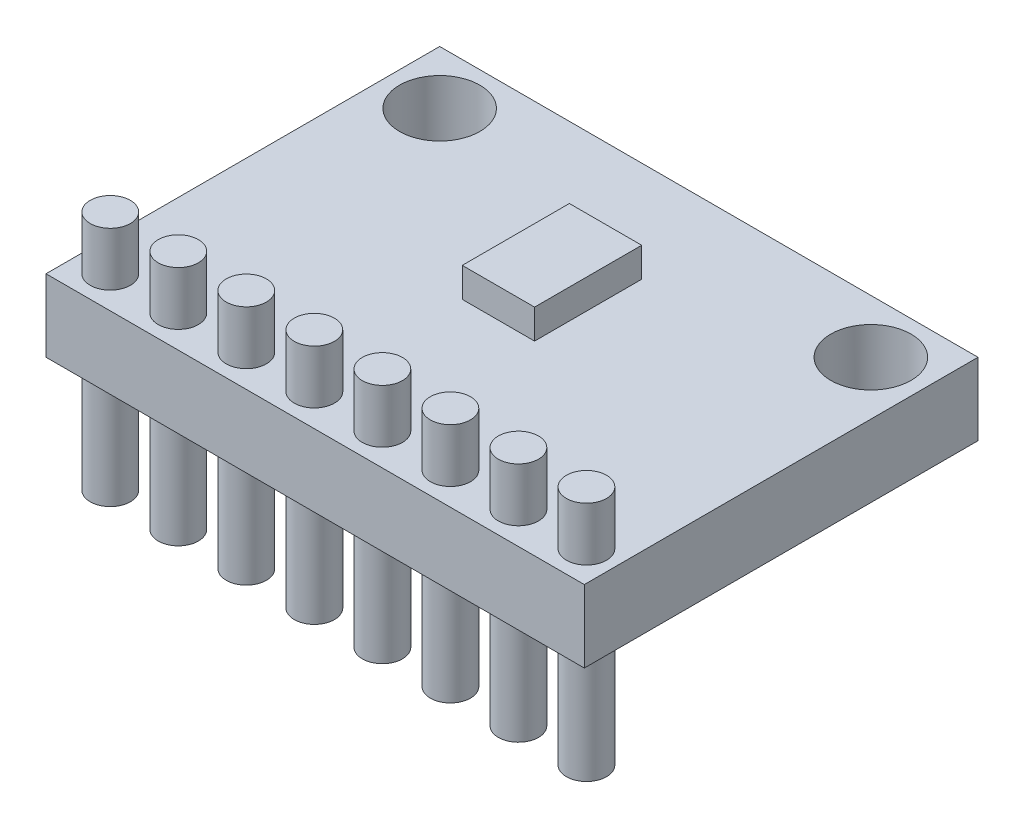
ISO-10303-21;
HEADER;
FILE_DESCRIPTION(('STEP AP214'),'2;1');
FILE_NAME('part.step','',(''),(''),'','','');
FILE_SCHEMA(('AUTOMOTIVE_DESIGN { 1 0 10303 214 1 1 1 1 }'));
ENDSEC;
DATA;
#1=APPLICATION_CONTEXT('core data for automotive mechanical design processes');
#2=APPLICATION_PROTOCOL_DEFINITION('international standard','automotive_design',2000,#1);
#3=PRODUCT_CONTEXT('',#1,'mechanical');
#4=PRODUCT('Part','Part','',(#3));
#5=PRODUCT_RELATED_PRODUCT_CATEGORY('part','',(#4));
#6=PRODUCT_DEFINITION_FORMATION('','',#4);
#7=PRODUCT_DEFINITION_CONTEXT('part definition',#1,'design');
#8=PRODUCT_DEFINITION('design','',#6,#7);
#9=PRODUCT_DEFINITION_SHAPE('','',#8);
#10=(LENGTH_UNIT() NAMED_UNIT(*) SI_UNIT(.MILLI.,.METRE.));
#11=(NAMED_UNIT(*) PLANE_ANGLE_UNIT() SI_UNIT($,.RADIAN.));
#12=(NAMED_UNIT(*) SI_UNIT($,.STERADIAN.) SOLID_ANGLE_UNIT());
#13=UNCERTAINTY_MEASURE_WITH_UNIT(LENGTH_MEASURE(1.E-05),#10,'distance_accuracy_value','');
#14=(GEOMETRIC_REPRESENTATION_CONTEXT(3) GLOBAL_UNCERTAINTY_ASSIGNED_CONTEXT((#13)) GLOBAL_UNIT_ASSIGNED_CONTEXT((#10,
#11,#12)) REPRESENTATION_CONTEXT('',''));
#15=CARTESIAN_POINT('',(0.,0.,0.));
#16=DIRECTION('',(0.,0.,1.));
#17=DIRECTION('',(1.,0.,0.));
#18=AXIS2_PLACEMENT_3D('',#15,#16,#17);
#19=CARTESIAN_POINT('',(0.,2.7,0.));
#20=DIRECTION('',(0.,1.,0.));
#21=DIRECTION('',(0.,0.,1.));
#22=AXIS2_PLACEMENT_3D('',#19,#20,#21);
#23=PLANE('',#22);
#24=CARTESIAN_POINT('',(-8.05,2.7,-5.35));
#25=DIRECTION('',(0.,1.,0.));
#26=DIRECTION('',(0.,0.,1.));
#27=AXIS2_PLACEMENT_3D('',#24,#25,#26);
#28=CIRCLE('',#27,1.5);
#29=CARTESIAN_POINT('',(-8.05,2.7,-3.85));
#30=VERTEX_POINT('',#29);
#31=EDGE_CURVE('E138',#30,#30,#28,.T.);
#32=ORIENTED_EDGE('',*,*,#31,.F.);
#33=EDGE_LOOP('',(#32));
#34=FACE_BOUND('',#33,.T.);
#35=CARTESIAN_POINT('',(8.05,2.7,-5.35));
#36=DIRECTION('',(0.,1.,0.));
#37=DIRECTION('',(0.,0.,-1.));
#38=AXIS2_PLACEMENT_3D('',#35,#36,#37);
#39=CIRCLE('',#38,1.5);
#40=CARTESIAN_POINT('',(8.05,2.7,-6.85));
#41=VERTEX_POINT('',#40);
#42=EDGE_CURVE('E135',#41,#41,#39,.T.);
#43=ORIENTED_EDGE('',*,*,#42,.F.);
#44=EDGE_LOOP('',(#43));
#45=FACE_BOUND('',#44,.T.);
#46=CARTESIAN_POINT('',(8.93,2.7,6.15));
#47=DIRECTION('',(0.,1.,0.));
#48=DIRECTION('',(0.,0.,1.));
#49=AXIS2_PLACEMENT_3D('',#46,#47,#48);
#50=CIRCLE('',#49,0.75);
#51=CARTESIAN_POINT('',(8.93,2.7,6.9));
#52=VERTEX_POINT('',#51);
#53=EDGE_CURVE('E11',#52,#52,#50,.T.);
#54=ORIENTED_EDGE('',*,*,#53,.F.);
#55=EDGE_LOOP('',(#54));
#56=FACE_BOUND('',#55,.T.);
#57=CARTESIAN_POINT('',(6.39,2.7,6.15));
#58=DIRECTION('',(0.,1.,0.));
#59=DIRECTION('',(0.,0.,1.));
#60=AXIS2_PLACEMENT_3D('',#57,#58,#59);
#61=CIRCLE('',#60,0.75);
#62=CARTESIAN_POINT('',(6.39,2.7,6.9));
#63=VERTEX_POINT('',#62);
#64=EDGE_CURVE('E42',#63,#63,#61,.T.);
#65=ORIENTED_EDGE('',*,*,#64,.F.);
#66=EDGE_LOOP('',(#65));
#67=FACE_BOUND('',#66,.T.);
#68=CARTESIAN_POINT('',(3.85,2.7,6.15));
#69=DIRECTION('',(0.,1.,0.));
#70=DIRECTION('',(0.,0.,1.));
#71=AXIS2_PLACEMENT_3D('',#68,#69,#70);
#72=CIRCLE('',#71,0.75);
#73=CARTESIAN_POINT('',(3.85,2.7,6.9));
#74=VERTEX_POINT('',#73);
#75=EDGE_CURVE('E162',#74,#74,#72,.T.);
#76=ORIENTED_EDGE('',*,*,#75,.F.);
#77=EDGE_LOOP('',(#76));
#78=FACE_BOUND('',#77,.T.);
#79=CARTESIAN_POINT('',(1.31,2.7,6.15));
#80=DIRECTION('',(0.,1.,0.));
#81=DIRECTION('',(0.,0.,1.));
#82=AXIS2_PLACEMENT_3D('',#79,#80,#81);
#83=CIRCLE('',#82,0.75);
#84=CARTESIAN_POINT('',(1.31,2.7,6.9));
#85=VERTEX_POINT('',#84);
#86=EDGE_CURVE('E172',#85,#85,#83,.T.);
#87=ORIENTED_EDGE('',*,*,#86,.F.);
#88=EDGE_LOOP('',(#87));
#89=FACE_BOUND('',#88,.T.);
#90=CARTESIAN_POINT('',(-1.23,2.7,6.15));
#91=DIRECTION('',(0.,1.,0.));
#92=DIRECTION('',(0.,0.,1.));
#93=AXIS2_PLACEMENT_3D('',#90,#91,#92);
#94=CIRCLE('',#93,0.75);
#95=CARTESIAN_POINT('',(-1.23,2.7,6.9));
#96=VERTEX_POINT('',#95);
#97=EDGE_CURVE('E182',#96,#96,#94,.T.);
#98=ORIENTED_EDGE('',*,*,#97,.F.);
#99=EDGE_LOOP('',(#98));
#100=FACE_BOUND('',#99,.T.);
#101=CARTESIAN_POINT('',(-3.77,2.7,6.15));
#102=DIRECTION('',(0.,1.,0.));
#103=DIRECTION('',(0.,0.,1.));
#104=AXIS2_PLACEMENT_3D('',#101,#102,#103);
#105=CIRCLE('',#104,0.75);
#106=CARTESIAN_POINT('',(-3.77,2.7,6.9));
#107=VERTEX_POINT('',#106);
#108=EDGE_CURVE('E192',#107,#107,#105,.T.);
#109=ORIENTED_EDGE('',*,*,#108,.F.);
#110=EDGE_LOOP('',(#109));
#111=FACE_BOUND('',#110,.T.);
#112=CARTESIAN_POINT('',(-6.31,2.7,6.15));
#113=DIRECTION('',(0.,1.,0.));
#114=DIRECTION('',(0.,0.,1.));
#115=AXIS2_PLACEMENT_3D('',#112,#113,#114);
#116=CIRCLE('',#115,0.75);
#117=CARTESIAN_POINT('',(-6.31,2.7,6.9));
#118=VERTEX_POINT('',#117);
#119=EDGE_CURVE('E202',#118,#118,#116,.T.);
#120=ORIENTED_EDGE('',*,*,#119,.F.);
#121=EDGE_LOOP('',(#120));
#122=FACE_BOUND('',#121,.T.);
#123=CARTESIAN_POINT('',(-8.85,2.7,6.15));
#124=DIRECTION('',(0.,1.,0.));
#125=DIRECTION('',(0.,0.,1.));
#126=AXIS2_PLACEMENT_3D('',#123,#124,#125);
#127=CIRCLE('',#126,0.75);
#128=CARTESIAN_POINT('',(-8.85,2.7,6.9));
#129=VERTEX_POINT('',#128);
#130=EDGE_CURVE('E212',#129,#129,#127,.T.);
#131=ORIENTED_EDGE('',*,*,#130,.F.);
#132=EDGE_LOOP('',(#131));
#133=FACE_BOUND('',#132,.T.);
#134=DIRECTION('',(0.,0.,1.));
#135=VECTOR('',#134,1.);
#136=CARTESIAN_POINT('',(-10.05,2.7,7.35));
#137=LINE('',#136,#135);
#138=CARTESIAN_POINT('',(-10.05,2.7,-7.35));
#139=VERTEX_POINT('',#138);
#140=CARTESIAN_POINT('',(-10.05,2.7,7.35));
#141=VERTEX_POINT('',#140);
#142=EDGE_CURVE('E223',#139,#141,#137,.T.);
#143=ORIENTED_EDGE('',*,*,#142,.T.);
#144=DIRECTION('',(1.,0.,0.));
#145=VECTOR('',#144,1.);
#146=CARTESIAN_POINT('',(10.05,2.7,7.35));
#147=LINE('',#146,#145);
#148=CARTESIAN_POINT('',(10.05,2.7,7.35));
#149=VERTEX_POINT('',#148);
#150=EDGE_CURVE('E88',#141,#149,#147,.T.);
#151=ORIENTED_EDGE('',*,*,#150,.T.);
#152=DIRECTION('',(0.,0.,-1.));
#153=VECTOR('',#152,1.);
#154=CARTESIAN_POINT('',(10.05,2.7,7.35));
#155=LINE('',#154,#153);
#156=CARTESIAN_POINT('',(10.05,2.7,-7.35));
#157=VERTEX_POINT('',#156);
#158=EDGE_CURVE('E226',#149,#157,#155,.T.);
#159=ORIENTED_EDGE('',*,*,#158,.T.);
#160=DIRECTION('',(-1.,0.,0.));
#161=VECTOR('',#160,1.);
#162=CARTESIAN_POINT('',(10.05,2.7,-7.35));
#163=LINE('',#162,#161);
#164=EDGE_CURVE('E59',#157,#139,#163,.T.);
#165=ORIENTED_EDGE('',*,*,#164,.T.);
#166=EDGE_LOOP('',(#143,#151,#159,#165));
#167=FACE_BOUND('',#166,.T.);
#168=DIRECTION('',(1.,0.,0.));
#169=VECTOR('',#168,1.);
#170=CARTESIAN_POINT('',(1.24921257015135,2.7,0.406762830798667));
#171=LINE('',#170,#169);
#172=CARTESIAN_POINT('',(-1.45078742984866,2.7,0.406762830798667));
#173=VERTEX_POINT('',#172);
#174=CARTESIAN_POINT('',(1.24921257015135,2.7,0.406762830798667));
#175=VERTEX_POINT('',#174);
#176=EDGE_CURVE('E316',#173,#175,#171,.T.);
#177=ORIENTED_EDGE('',*,*,#176,.F.);
#178=DIRECTION('',(0.,0.,1.));
#179=VECTOR('',#178,1.);
#180=CARTESIAN_POINT('',(-1.45078742984866,2.7,-3.59323716920133));
#181=LINE('',#180,#179);
#182=CARTESIAN_POINT('',(-1.45078742984866,2.7,-3.59323716920133));
#183=VERTEX_POINT('',#182);
#184=EDGE_CURVE('E133',#183,#173,#181,.T.);
#185=ORIENTED_EDGE('',*,*,#184,.F.);
#186=DIRECTION('',(-1.,0.,0.));
#187=VECTOR('',#186,1.);
#188=CARTESIAN_POINT('',(1.24921257015134,2.7,-3.59323716920133));
#189=LINE('',#188,#187);
#190=CARTESIAN_POINT('',(1.24921257015134,2.7,-3.59323716920133));
#191=VERTEX_POINT('',#190);
#192=EDGE_CURVE('E129',#191,#183,#189,.T.);
#193=ORIENTED_EDGE('',*,*,#192,.F.);
#194=DIRECTION('',(0.,0.,-1.));
#195=VECTOR('',#194,1.);
#196=CARTESIAN_POINT('',(1.24921257015134,2.7,-3.59323716920133));
#197=LINE('',#196,#195);
#198=EDGE_CURVE('E318',#175,#191,#197,.T.);
#199=ORIENTED_EDGE('',*,*,#198,.F.);
#200=EDGE_LOOP('',(#177,#185,#193,#199));
#201=FACE_BOUND('',#200,.T.);
#202=ADVANCED_FACE('F33',(#34,#45,#56,#67,#78,#89,#100,#111,#122,#133,#167,#201),#23,.T.);
#203=CARTESIAN_POINT('',(-10.05,2.7,7.35));
#204=DIRECTION('',(1.,0.,0.));
#205=DIRECTION('',(0.,0.,-1.));
#206=AXIS2_PLACEMENT_3D('',#203,#204,#205);
#207=PLANE('',#206);
#208=DIRECTION('',(0.,0.,1.));
#209=VECTOR('',#208,1.);
#210=CARTESIAN_POINT('',(-10.05,0.,7.35));
#211=LINE('',#210,#209);
#212=CARTESIAN_POINT('',(-10.05,0.,-7.35));
#213=VERTEX_POINT('',#212);
#214=CARTESIAN_POINT('',(-10.05,0.,7.35));
#215=VERTEX_POINT('',#214);
#216=EDGE_CURVE('E230',#213,#215,#211,.T.);
#217=ORIENTED_EDGE('',*,*,#216,.T.);
#218=DIRECTION('',(0.,-1.,0.));
#219=VECTOR('',#218,1.);
#220=CARTESIAN_POINT('',(-10.05,2.7,7.35));
#221=LINE('',#220,#219);
#222=EDGE_CURVE('E222',#141,#215,#221,.T.);
#223=ORIENTED_EDGE('',*,*,#222,.F.);
#224=ORIENTED_EDGE('',*,*,#142,.F.);
#225=DIRECTION('',(0.,-1.,0.));
#226=VECTOR('',#225,1.);
#227=CARTESIAN_POINT('',(-10.05,2.7,-7.35));
#228=LINE('',#227,#226);
#229=EDGE_CURVE('E229',#139,#213,#228,.T.);
#230=ORIENTED_EDGE('',*,*,#229,.T.);
#231=EDGE_LOOP('',(#217,#223,#224,#230));
#232=FACE_BOUND('',#231,.T.);
#233=ADVANCED_FACE('F35',(#232),#207,.F.);
#234=CARTESIAN_POINT('',(10.05,2.7,7.35));
#235=DIRECTION('',(0.,0.,-1.));
#236=DIRECTION('',(-1.,0.,0.));
#237=AXIS2_PLACEMENT_3D('',#234,#235,#236);
#238=PLANE('',#237);
#239=DIRECTION('',(1.,0.,0.));
#240=VECTOR('',#239,1.);
#241=CARTESIAN_POINT('',(10.05,0.,7.35));
#242=LINE('',#241,#240);
#243=CARTESIAN_POINT('',(10.05,0.,7.35));
#244=VERTEX_POINT('',#243);
#245=EDGE_CURVE('E233',#215,#244,#242,.T.);
#246=ORIENTED_EDGE('',*,*,#245,.T.);
#247=DIRECTION('',(0.,-1.,0.));
#248=VECTOR('',#247,1.);
#249=CARTESIAN_POINT('',(10.05,2.7,7.35));
#250=LINE('',#249,#248);
#251=EDGE_CURVE('E241',#149,#244,#250,.T.);
#252=ORIENTED_EDGE('',*,*,#251,.F.);
#253=ORIENTED_EDGE('',*,*,#150,.F.);
#254=ORIENTED_EDGE('',*,*,#222,.T.);
#255=EDGE_LOOP('',(#246,#252,#253,#254));
#256=FACE_BOUND('',#255,.T.);
#257=ADVANCED_FACE('F287',(#256),#238,.F.);
#258=CARTESIAN_POINT('',(10.05,2.7,7.35));
#259=DIRECTION('',(-1.,0.,0.));
#260=DIRECTION('',(0.,0.,1.));
#261=AXIS2_PLACEMENT_3D('',#258,#259,#260);
#262=PLANE('',#261);
#263=DIRECTION('',(0.,0.,-1.));
#264=VECTOR('',#263,1.);
#265=CARTESIAN_POINT('',(10.05,0.,7.35));
#266=LINE('',#265,#264);
#267=CARTESIAN_POINT('',(10.05,0.,-7.35));
#268=VERTEX_POINT('',#267);
#269=EDGE_CURVE('E235',#244,#268,#266,.T.);
#270=ORIENTED_EDGE('',*,*,#269,.T.);
#271=DIRECTION('',(0.,-1.,0.));
#272=VECTOR('',#271,1.);
#273=CARTESIAN_POINT('',(10.05,2.7,-7.35));
#274=LINE('',#273,#272);
#275=EDGE_CURVE('E239',#157,#268,#274,.T.);
#276=ORIENTED_EDGE('',*,*,#275,.F.);
#277=ORIENTED_EDGE('',*,*,#158,.F.);
#278=ORIENTED_EDGE('',*,*,#251,.T.);
#279=EDGE_LOOP('',(#270,#276,#277,#278));
#280=FACE_BOUND('',#279,.T.);
#281=ADVANCED_FACE('F301',(#280),#262,.F.);
#282=CARTESIAN_POINT('',(10.05,2.7,-7.35));
#283=DIRECTION('',(0.,0.,1.));
#284=DIRECTION('',(1.,0.,0.));
#285=AXIS2_PLACEMENT_3D('',#282,#283,#284);
#286=PLANE('',#285);
#287=DIRECTION('',(-1.,0.,0.));
#288=VECTOR('',#287,1.);
#289=CARTESIAN_POINT('',(10.05,0.,-7.35));
#290=LINE('',#289,#288);
#291=EDGE_CURVE('E80',#268,#213,#290,.T.);
#292=ORIENTED_EDGE('',*,*,#291,.T.);
#293=ORIENTED_EDGE('',*,*,#229,.F.);
#294=ORIENTED_EDGE('',*,*,#164,.F.);
#295=ORIENTED_EDGE('',*,*,#275,.T.);
#296=EDGE_LOOP('',(#292,#293,#294,#295));
#297=FACE_BOUND('',#296,.T.);
#298=ADVANCED_FACE('F298',(#297),#286,.F.);
#299=CARTESIAN_POINT('',(0.,0.,0.));
#300=DIRECTION('',(0.,1.,0.));
#301=DIRECTION('',(0.,0.,1.));
#302=AXIS2_PLACEMENT_3D('',#299,#300,#301);
#303=PLANE('',#302);
#304=CARTESIAN_POINT('',(-8.05,0.,-5.35));
#305=DIRECTION('',(0.,1.,0.));
#306=DIRECTION('',(0.,0.,1.));
#307=AXIS2_PLACEMENT_3D('',#304,#305,#306);
#308=CIRCLE('',#307,1.5);
#309=CARTESIAN_POINT('',(-8.05,0.,-3.85));
#310=VERTEX_POINT('',#309);
#311=EDGE_CURVE('E37',#310,#310,#308,.T.);
#312=ORIENTED_EDGE('',*,*,#311,.T.);
#313=EDGE_LOOP('',(#312));
#314=FACE_BOUND('',#313,.T.);
#315=CARTESIAN_POINT('',(8.05,0.,-5.35));
#316=DIRECTION('',(0.,1.,0.));
#317=DIRECTION('',(0.,0.,1.));
#318=AXIS2_PLACEMENT_3D('',#315,#316,#317);
#319=CIRCLE('',#318,1.5);
#320=CARTESIAN_POINT('',(8.05,0.,-3.85));
#321=VERTEX_POINT('',#320);
#322=EDGE_CURVE('E144',#321,#321,#319,.T.);
#323=ORIENTED_EDGE('',*,*,#322,.T.);
#324=EDGE_LOOP('',(#323));
#325=FACE_BOUND('',#324,.T.);
#326=CARTESIAN_POINT('',(8.93,0.,6.15));
#327=DIRECTION('',(0.,1.,0.));
#328=DIRECTION('',(0.,0.,1.));
#329=AXIS2_PLACEMENT_3D('',#326,#327,#328);
#330=CIRCLE('',#329,0.75);
#331=CARTESIAN_POINT('',(8.93,0.,6.9));
#332=VERTEX_POINT('',#331);
#333=EDGE_CURVE('E151',#332,#332,#330,.T.);
#334=ORIENTED_EDGE('',*,*,#333,.T.);
#335=EDGE_LOOP('',(#334));
#336=FACE_BOUND('',#335,.T.);
#337=CARTESIAN_POINT('',(6.39,0.,6.15));
#338=DIRECTION('',(0.,1.,0.));
#339=DIRECTION('',(0.,0.,1.));
#340=AXIS2_PLACEMENT_3D('',#337,#338,#339);
#341=CIRCLE('',#340,0.75);
#342=CARTESIAN_POINT('',(6.39,0.,6.9));
#343=VERTEX_POINT('',#342);
#344=EDGE_CURVE('E159',#343,#343,#341,.T.);
#345=ORIENTED_EDGE('',*,*,#344,.T.);
#346=EDGE_LOOP('',(#345));
#347=FACE_BOUND('',#346,.T.);
#348=CARTESIAN_POINT('',(3.85,0.,6.15));
#349=DIRECTION('',(0.,1.,0.));
#350=DIRECTION('',(0.,0.,1.));
#351=AXIS2_PLACEMENT_3D('',#348,#349,#350);
#352=CIRCLE('',#351,0.75);
#353=CARTESIAN_POINT('',(3.85,0.,6.9));
#354=VERTEX_POINT('',#353);
#355=EDGE_CURVE('E169',#354,#354,#352,.T.);
#356=ORIENTED_EDGE('',*,*,#355,.T.);
#357=EDGE_LOOP('',(#356));
#358=FACE_BOUND('',#357,.T.);
#359=CARTESIAN_POINT('',(1.31,0.,6.15));
#360=DIRECTION('',(0.,1.,0.));
#361=DIRECTION('',(0.,0.,1.));
#362=AXIS2_PLACEMENT_3D('',#359,#360,#361);
#363=CIRCLE('',#362,0.75);
#364=CARTESIAN_POINT('',(1.31,0.,6.9));
#365=VERTEX_POINT('',#364);
#366=EDGE_CURVE('E179',#365,#365,#363,.T.);
#367=ORIENTED_EDGE('',*,*,#366,.T.);
#368=EDGE_LOOP('',(#367));
#369=FACE_BOUND('',#368,.T.);
#370=CARTESIAN_POINT('',(-1.23,0.,6.15));
#371=DIRECTION('',(0.,1.,0.));
#372=DIRECTION('',(0.,0.,1.));
#373=AXIS2_PLACEMENT_3D('',#370,#371,#372);
#374=CIRCLE('',#373,0.75);
#375=CARTESIAN_POINT('',(-1.23,0.,6.9));
#376=VERTEX_POINT('',#375);
#377=EDGE_CURVE('E189',#376,#376,#374,.T.);
#378=ORIENTED_EDGE('',*,*,#377,.T.);
#379=EDGE_LOOP('',(#378));
#380=FACE_BOUND('',#379,.T.);
#381=CARTESIAN_POINT('',(-3.77,0.,6.15));
#382=DIRECTION('',(0.,1.,0.));
#383=DIRECTION('',(0.,0.,1.));
#384=AXIS2_PLACEMENT_3D('',#381,#382,#383);
#385=CIRCLE('',#384,0.75);
#386=CARTESIAN_POINT('',(-3.77,0.,6.9));
#387=VERTEX_POINT('',#386);
#388=EDGE_CURVE('E199',#387,#387,#385,.T.);
#389=ORIENTED_EDGE('',*,*,#388,.T.);
#390=EDGE_LOOP('',(#389));
#391=FACE_BOUND('',#390,.T.);
#392=CARTESIAN_POINT('',(-6.31,0.,6.15));
#393=DIRECTION('',(0.,1.,0.));
#394=DIRECTION('',(0.,0.,1.));
#395=AXIS2_PLACEMENT_3D('',#392,#393,#394);
#396=CIRCLE('',#395,0.75);
#397=CARTESIAN_POINT('',(-6.31,0.,6.9));
#398=VERTEX_POINT('',#397);
#399=EDGE_CURVE('E209',#398,#398,#396,.T.);
#400=ORIENTED_EDGE('',*,*,#399,.T.);
#401=EDGE_LOOP('',(#400));
#402=FACE_BOUND('',#401,.T.);
#403=CARTESIAN_POINT('',(-8.85,0.,6.15));
#404=DIRECTION('',(0.,1.,0.));
#405=DIRECTION('',(0.,0.,1.));
#406=AXIS2_PLACEMENT_3D('',#403,#404,#405);
#407=CIRCLE('',#406,0.75);
#408=CARTESIAN_POINT('',(-8.85,0.,6.9));
#409=VERTEX_POINT('',#408);
#410=EDGE_CURVE('E219',#409,#409,#407,.T.);
#411=ORIENTED_EDGE('',*,*,#410,.T.);
#412=EDGE_LOOP('',(#411));
#413=FACE_BOUND('',#412,.T.);
#414=ORIENTED_EDGE('',*,*,#216,.F.);
#415=ORIENTED_EDGE('',*,*,#291,.F.);
#416=ORIENTED_EDGE('',*,*,#269,.F.);
#417=ORIENTED_EDGE('',*,*,#245,.F.);
#418=EDGE_LOOP('',(#414,#415,#416,#417));
#419=FACE_BOUND('',#418,.T.);
#420=ADVANCED_FACE('F266',(#314,#325,#336,#347,#358,#369,#380,#391,#402,#413,#419),#303,.F.);
#421=CARTESIAN_POINT('',(-8.85,-4.3,6.15));
#422=DIRECTION('',(0.,1.,0.));
#423=DIRECTION('',(0.,0.,1.));
#424=AXIS2_PLACEMENT_3D('',#421,#422,#423);
#425=PLANE('',#424);
#426=CARTESIAN_POINT('',(-8.85,-4.3,6.15));
#427=DIRECTION('',(0.,1.,0.));
#428=DIRECTION('',(0.,0.,1.));
#429=AXIS2_PLACEMENT_3D('',#426,#427,#428);
#430=CIRCLE('',#429,0.75);
#431=CARTESIAN_POINT('',(-8.85,-4.3,6.9));
#432=VERTEX_POINT('',#431);
#433=EDGE_CURVE('E216',#432,#432,#430,.T.);
#434=ORIENTED_EDGE('',*,*,#433,.F.);
#435=EDGE_LOOP('',(#434));
#436=FACE_BOUND('',#435,.T.);
#437=ADVANCED_FACE('F297',(#436),#425,.F.);
#438=CARTESIAN_POINT('',(-8.85,-4.3,6.15));
#439=DIRECTION('',(0.,1.,0.));
#440=DIRECTION('',(0.,0.,1.));
#441=AXIS2_PLACEMENT_3D('',#438,#439,#440);
#442=CYLINDRICAL_SURFACE('',#441,0.75);
#443=ORIENTED_EDGE('',*,*,#433,.T.);
#444=EDGE_LOOP('',(#443));
#445=FACE_BOUND('',#444,.T.);
#446=ORIENTED_EDGE('',*,*,#410,.F.);
#447=EDGE_LOOP('',(#446));
#448=FACE_BOUND('',#447,.T.);
#449=ADVANCED_FACE('F641',(#445,#448),#442,.T.);
#450=ORIENTED_EDGE('',*,*,#130,.T.);
#451=EDGE_LOOP('',(#450));
#452=FACE_BOUND('',#451,.T.);
#453=CARTESIAN_POINT('',(-8.85,4.7,6.15));
#454=DIRECTION('',(0.,1.,0.));
#455=DIRECTION('',(0.,0.,1.));
#456=AXIS2_PLACEMENT_3D('',#453,#454,#455);
#457=CIRCLE('',#456,0.75);
#458=CARTESIAN_POINT('',(-8.85,4.7,6.9));
#459=VERTEX_POINT('',#458);
#460=EDGE_CURVE('E213',#459,#459,#457,.T.);
#461=ORIENTED_EDGE('',*,*,#460,.F.);
#462=EDGE_LOOP('',(#461));
#463=FACE_BOUND('',#462,.T.);
#464=ADVANCED_FACE('F293',(#452,#463),#442,.T.);
#465=CARTESIAN_POINT('',(-8.85,4.7,6.15));
#466=DIRECTION('',(0.,1.,0.));
#467=DIRECTION('',(0.,0.,1.));
#468=AXIS2_PLACEMENT_3D('',#465,#466,#467);
#469=PLANE('',#468);
#470=ORIENTED_EDGE('',*,*,#460,.T.);
#471=EDGE_LOOP('',(#470));
#472=FACE_BOUND('',#471,.T.);
#473=ADVANCED_FACE('F624',(#472),#469,.T.);
#474=CARTESIAN_POINT('',(-6.31,-4.3,6.15));
#475=DIRECTION('',(0.,1.,0.));
#476=DIRECTION('',(0.,0.,1.));
#477=AXIS2_PLACEMENT_3D('',#474,#475,#476);
#478=PLANE('',#477);
#479=CARTESIAN_POINT('',(-6.31,-4.3,6.15));
#480=DIRECTION('',(0.,1.,0.));
#481=DIRECTION('',(0.,0.,1.));
#482=AXIS2_PLACEMENT_3D('',#479,#480,#481);
#483=CIRCLE('',#482,0.75);
#484=CARTESIAN_POINT('',(-6.31,-4.3,6.9));
#485=VERTEX_POINT('',#484);
#486=EDGE_CURVE('E206',#485,#485,#483,.T.);
#487=ORIENTED_EDGE('',*,*,#486,.F.);
#488=EDGE_LOOP('',(#487));
#489=FACE_BOUND('',#488,.T.);
#490=ADVANCED_FACE('F616',(#489),#478,.F.);
#491=CARTESIAN_POINT('',(-6.31,-4.3,6.15));
#492=DIRECTION('',(0.,1.,0.));
#493=DIRECTION('',(0.,0.,1.));
#494=AXIS2_PLACEMENT_3D('',#491,#492,#493);
#495=CYLINDRICAL_SURFACE('',#494,0.75);
#496=ORIENTED_EDGE('',*,*,#486,.T.);
#497=EDGE_LOOP('',(#496));
#498=FACE_BOUND('',#497,.T.);
#499=ORIENTED_EDGE('',*,*,#399,.F.);
#500=EDGE_LOOP('',(#499));
#501=FACE_BOUND('',#500,.T.);
#502=ADVANCED_FACE('F607',(#498,#501),#495,.T.);
#503=ORIENTED_EDGE('',*,*,#119,.T.);
#504=EDGE_LOOP('',(#503));
#505=FACE_BOUND('',#504,.T.);
#506=CARTESIAN_POINT('',(-6.31,4.7,6.15));
#507=DIRECTION('',(0.,1.,0.));
#508=DIRECTION('',(0.,0.,1.));
#509=AXIS2_PLACEMENT_3D('',#506,#507,#508);
#510=CIRCLE('',#509,0.75);
#511=CARTESIAN_POINT('',(-6.31,4.7,6.9));
#512=VERTEX_POINT('',#511);
#513=EDGE_CURVE('E203',#512,#512,#510,.T.);
#514=ORIENTED_EDGE('',*,*,#513,.F.);
#515=EDGE_LOOP('',(#514));
#516=FACE_BOUND('',#515,.T.);
#517=ADVANCED_FACE('F598',(#505,#516),#495,.T.);
#518=CARTESIAN_POINT('',(-6.31,4.7,6.15));
#519=DIRECTION('',(0.,1.,0.));
#520=DIRECTION('',(0.,0.,1.));
#521=AXIS2_PLACEMENT_3D('',#518,#519,#520);
#522=PLANE('',#521);
#523=ORIENTED_EDGE('',*,*,#513,.T.);
#524=EDGE_LOOP('',(#523));
#525=FACE_BOUND('',#524,.T.);
#526=ADVANCED_FACE('F589',(#525),#522,.T.);
#527=CARTESIAN_POINT('',(-3.77,-4.3,6.15));
#528=DIRECTION('',(0.,1.,0.));
#529=DIRECTION('',(0.,0.,1.));
#530=AXIS2_PLACEMENT_3D('',#527,#528,#529);
#531=PLANE('',#530);
#532=CARTESIAN_POINT('',(-3.77,-4.3,6.15));
#533=DIRECTION('',(0.,1.,0.));
#534=DIRECTION('',(0.,0.,1.));
#535=AXIS2_PLACEMENT_3D('',#532,#533,#534);
#536=CIRCLE('',#535,0.75);
#537=CARTESIAN_POINT('',(-3.77,-4.3,6.9));
#538=VERTEX_POINT('',#537);
#539=EDGE_CURVE('E196',#538,#538,#536,.T.);
#540=ORIENTED_EDGE('',*,*,#539,.F.);
#541=EDGE_LOOP('',(#540));
#542=FACE_BOUND('',#541,.T.);
#543=ADVANCED_FACE('F581',(#542),#531,.F.);
#544=CARTESIAN_POINT('',(-3.77,-4.3,6.15));
#545=DIRECTION('',(0.,1.,0.));
#546=DIRECTION('',(0.,0.,1.));
#547=AXIS2_PLACEMENT_3D('',#544,#545,#546);
#548=CYLINDRICAL_SURFACE('',#547,0.75);
#549=ORIENTED_EDGE('',*,*,#539,.T.);
#550=EDGE_LOOP('',(#549));
#551=FACE_BOUND('',#550,.T.);
#552=ORIENTED_EDGE('',*,*,#388,.F.);
#553=EDGE_LOOP('',(#552));
#554=FACE_BOUND('',#553,.T.);
#555=ADVANCED_FACE('F572',(#551,#554),#548,.T.);
#556=ORIENTED_EDGE('',*,*,#108,.T.);
#557=EDGE_LOOP('',(#556));
#558=FACE_BOUND('',#557,.T.);
#559=CARTESIAN_POINT('',(-3.77,4.7,6.15));
#560=DIRECTION('',(0.,1.,0.));
#561=DIRECTION('',(0.,0.,1.));
#562=AXIS2_PLACEMENT_3D('',#559,#560,#561);
#563=CIRCLE('',#562,0.75);
#564=CARTESIAN_POINT('',(-3.77,4.7,6.9));
#565=VERTEX_POINT('',#564);
#566=EDGE_CURVE('E193',#565,#565,#563,.T.);
#567=ORIENTED_EDGE('',*,*,#566,.F.);
#568=EDGE_LOOP('',(#567));
#569=FACE_BOUND('',#568,.T.);
#570=ADVANCED_FACE('F563',(#558,#569),#548,.T.);
#571=CARTESIAN_POINT('',(-3.77,4.7,6.15));
#572=DIRECTION('',(0.,1.,0.));
#573=DIRECTION('',(0.,0.,1.));
#574=AXIS2_PLACEMENT_3D('',#571,#572,#573);
#575=PLANE('',#574);
#576=ORIENTED_EDGE('',*,*,#566,.T.);
#577=EDGE_LOOP('',(#576));
#578=FACE_BOUND('',#577,.T.);
#579=ADVANCED_FACE('F554',(#578),#575,.T.);
#580=CARTESIAN_POINT('',(-1.23,-4.3,6.15));
#581=DIRECTION('',(0.,1.,0.));
#582=DIRECTION('',(0.,0.,1.));
#583=AXIS2_PLACEMENT_3D('',#580,#581,#582);
#584=PLANE('',#583);
#585=CARTESIAN_POINT('',(-1.23,-4.3,6.15));
#586=DIRECTION('',(0.,1.,0.));
#587=DIRECTION('',(0.,0.,1.));
#588=AXIS2_PLACEMENT_3D('',#585,#586,#587);
#589=CIRCLE('',#588,0.75);
#590=CARTESIAN_POINT('',(-1.23,-4.3,6.9));
#591=VERTEX_POINT('',#590);
#592=EDGE_CURVE('E186',#591,#591,#589,.T.);
#593=ORIENTED_EDGE('',*,*,#592,.F.);
#594=EDGE_LOOP('',(#593));
#595=FACE_BOUND('',#594,.T.);
#596=ADVANCED_FACE('F546',(#595),#584,.F.);
#597=CARTESIAN_POINT('',(-1.23,-4.3,6.15));
#598=DIRECTION('',(0.,1.,0.));
#599=DIRECTION('',(0.,0.,1.));
#600=AXIS2_PLACEMENT_3D('',#597,#598,#599);
#601=CYLINDRICAL_SURFACE('',#600,0.75);
#602=ORIENTED_EDGE('',*,*,#592,.T.);
#603=EDGE_LOOP('',(#602));
#604=FACE_BOUND('',#603,.T.);
#605=ORIENTED_EDGE('',*,*,#377,.F.);
#606=EDGE_LOOP('',(#605));
#607=FACE_BOUND('',#606,.T.);
#608=ADVANCED_FACE('F537',(#604,#607),#601,.T.);
#609=ORIENTED_EDGE('',*,*,#97,.T.);
#610=EDGE_LOOP('',(#609));
#611=FACE_BOUND('',#610,.T.);
#612=CARTESIAN_POINT('',(-1.23,4.7,6.15));
#613=DIRECTION('',(0.,1.,0.));
#614=DIRECTION('',(0.,0.,1.));
#615=AXIS2_PLACEMENT_3D('',#612,#613,#614);
#616=CIRCLE('',#615,0.75);
#617=CARTESIAN_POINT('',(-1.23,4.7,6.9));
#618=VERTEX_POINT('',#617);
#619=EDGE_CURVE('E183',#618,#618,#616,.T.);
#620=ORIENTED_EDGE('',*,*,#619,.F.);
#621=EDGE_LOOP('',(#620));
#622=FACE_BOUND('',#621,.T.);
#623=ADVANCED_FACE('F528',(#611,#622),#601,.T.);
#624=CARTESIAN_POINT('',(-1.23,4.7,6.15));
#625=DIRECTION('',(0.,1.,0.));
#626=DIRECTION('',(0.,0.,1.));
#627=AXIS2_PLACEMENT_3D('',#624,#625,#626);
#628=PLANE('',#627);
#629=ORIENTED_EDGE('',*,*,#619,.T.);
#630=EDGE_LOOP('',(#629));
#631=FACE_BOUND('',#630,.T.);
#632=ADVANCED_FACE('F519',(#631),#628,.T.);
#633=CARTESIAN_POINT('',(1.31,-4.3,6.15));
#634=DIRECTION('',(0.,1.,0.));
#635=DIRECTION('',(0.,0.,1.));
#636=AXIS2_PLACEMENT_3D('',#633,#634,#635);
#637=PLANE('',#636);
#638=CARTESIAN_POINT('',(1.31,-4.3,6.15));
#639=DIRECTION('',(0.,1.,0.));
#640=DIRECTION('',(0.,0.,1.));
#641=AXIS2_PLACEMENT_3D('',#638,#639,#640);
#642=CIRCLE('',#641,0.75);
#643=CARTESIAN_POINT('',(1.31,-4.3,6.9));
#644=VERTEX_POINT('',#643);
#645=EDGE_CURVE('E176',#644,#644,#642,.T.);
#646=ORIENTED_EDGE('',*,*,#645,.F.);
#647=EDGE_LOOP('',(#646));
#648=FACE_BOUND('',#647,.T.);
#649=ADVANCED_FACE('F511',(#648),#637,.F.);
#650=CARTESIAN_POINT('',(1.31,-4.3,6.15));
#651=DIRECTION('',(0.,1.,0.));
#652=DIRECTION('',(0.,0.,1.));
#653=AXIS2_PLACEMENT_3D('',#650,#651,#652);
#654=CYLINDRICAL_SURFACE('',#653,0.75);
#655=ORIENTED_EDGE('',*,*,#645,.T.);
#656=EDGE_LOOP('',(#655));
#657=FACE_BOUND('',#656,.T.);
#658=ORIENTED_EDGE('',*,*,#366,.F.);
#659=EDGE_LOOP('',(#658));
#660=FACE_BOUND('',#659,.T.);
#661=ADVANCED_FACE('F502',(#657,#660),#654,.T.);
#662=ORIENTED_EDGE('',*,*,#86,.T.);
#663=EDGE_LOOP('',(#662));
#664=FACE_BOUND('',#663,.T.);
#665=CARTESIAN_POINT('',(1.31,4.7,6.15));
#666=DIRECTION('',(0.,1.,0.));
#667=DIRECTION('',(0.,0.,1.));
#668=AXIS2_PLACEMENT_3D('',#665,#666,#667);
#669=CIRCLE('',#668,0.75);
#670=CARTESIAN_POINT('',(1.31,4.7,6.9));
#671=VERTEX_POINT('',#670);
#672=EDGE_CURVE('E173',#671,#671,#669,.T.);
#673=ORIENTED_EDGE('',*,*,#672,.F.);
#674=EDGE_LOOP('',(#673));
#675=FACE_BOUND('',#674,.T.);
#676=ADVANCED_FACE('F493',(#664,#675),#654,.T.);
#677=CARTESIAN_POINT('',(1.31,4.7,6.15));
#678=DIRECTION('',(0.,1.,0.));
#679=DIRECTION('',(0.,0.,1.));
#680=AXIS2_PLACEMENT_3D('',#677,#678,#679);
#681=PLANE('',#680);
#682=ORIENTED_EDGE('',*,*,#672,.T.);
#683=EDGE_LOOP('',(#682));
#684=FACE_BOUND('',#683,.T.);
#685=ADVANCED_FACE('F484',(#684),#681,.T.);
#686=CARTESIAN_POINT('',(3.85,-4.3,6.15));
#687=DIRECTION('',(0.,1.,0.));
#688=DIRECTION('',(0.,0.,1.));
#689=AXIS2_PLACEMENT_3D('',#686,#687,#688);
#690=PLANE('',#689);
#691=CARTESIAN_POINT('',(3.85,-4.3,6.15));
#692=DIRECTION('',(0.,1.,0.));
#693=DIRECTION('',(0.,0.,1.));
#694=AXIS2_PLACEMENT_3D('',#691,#692,#693);
#695=CIRCLE('',#694,0.75);
#696=CARTESIAN_POINT('',(3.85,-4.3,6.9));
#697=VERTEX_POINT('',#696);
#698=EDGE_CURVE('E166',#697,#697,#695,.T.);
#699=ORIENTED_EDGE('',*,*,#698,.F.);
#700=EDGE_LOOP('',(#699));
#701=FACE_BOUND('',#700,.T.);
#702=ADVANCED_FACE('F476',(#701),#690,.F.);
#703=CARTESIAN_POINT('',(3.85,-4.3,6.15));
#704=DIRECTION('',(0.,1.,0.));
#705=DIRECTION('',(0.,0.,1.));
#706=AXIS2_PLACEMENT_3D('',#703,#704,#705);
#707=CYLINDRICAL_SURFACE('',#706,0.75);
#708=ORIENTED_EDGE('',*,*,#698,.T.);
#709=EDGE_LOOP('',(#708));
#710=FACE_BOUND('',#709,.T.);
#711=ORIENTED_EDGE('',*,*,#355,.F.);
#712=EDGE_LOOP('',(#711));
#713=FACE_BOUND('',#712,.T.);
#714=ADVANCED_FACE('F467',(#710,#713),#707,.T.);
#715=ORIENTED_EDGE('',*,*,#75,.T.);
#716=EDGE_LOOP('',(#715));
#717=FACE_BOUND('',#716,.T.);
#718=CARTESIAN_POINT('',(3.85,4.7,6.15));
#719=DIRECTION('',(0.,1.,0.));
#720=DIRECTION('',(0.,0.,1.));
#721=AXIS2_PLACEMENT_3D('',#718,#719,#720);
#722=CIRCLE('',#721,0.75);
#723=CARTESIAN_POINT('',(3.85,4.7,6.9));
#724=VERTEX_POINT('',#723);
#725=EDGE_CURVE('E163',#724,#724,#722,.T.);
#726=ORIENTED_EDGE('',*,*,#725,.F.);
#727=EDGE_LOOP('',(#726));
#728=FACE_BOUND('',#727,.T.);
#729=ADVANCED_FACE('F458',(#717,#728),#707,.T.);
#730=CARTESIAN_POINT('',(3.85,4.7,6.15));
#731=DIRECTION('',(0.,1.,0.));
#732=DIRECTION('',(0.,0.,1.));
#733=AXIS2_PLACEMENT_3D('',#730,#731,#732);
#734=PLANE('',#733);
#735=ORIENTED_EDGE('',*,*,#725,.T.);
#736=EDGE_LOOP('',(#735));
#737=FACE_BOUND('',#736,.T.);
#738=ADVANCED_FACE('F449',(#737),#734,.T.);
#739=CARTESIAN_POINT('',(6.39,-4.3,6.15));
#740=DIRECTION('',(0.,1.,0.));
#741=DIRECTION('',(0.,0.,1.));
#742=AXIS2_PLACEMENT_3D('',#739,#740,#741);
#743=PLANE('',#742);
#744=CARTESIAN_POINT('',(6.39,-4.3,6.15));
#745=DIRECTION('',(0.,1.,0.));
#746=DIRECTION('',(0.,0.,1.));
#747=AXIS2_PLACEMENT_3D('',#744,#745,#746);
#748=CIRCLE('',#747,0.75);
#749=CARTESIAN_POINT('',(6.39,-4.3,6.9));
#750=VERTEX_POINT('',#749);
#751=EDGE_CURVE('E156',#750,#750,#748,.T.);
#752=ORIENTED_EDGE('',*,*,#751,.F.);
#753=EDGE_LOOP('',(#752));
#754=FACE_BOUND('',#753,.T.);
#755=ADVANCED_FACE('F441',(#754),#743,.F.);
#756=CARTESIAN_POINT('',(6.39,-4.3,6.15));
#757=DIRECTION('',(0.,1.,0.));
#758=DIRECTION('',(0.,0.,1.));
#759=AXIS2_PLACEMENT_3D('',#756,#757,#758);
#760=CYLINDRICAL_SURFACE('',#759,0.75);
#761=ORIENTED_EDGE('',*,*,#751,.T.);
#762=EDGE_LOOP('',(#761));
#763=FACE_BOUND('',#762,.T.);
#764=ORIENTED_EDGE('',*,*,#344,.F.);
#765=EDGE_LOOP('',(#764));
#766=FACE_BOUND('',#765,.T.);
#767=ADVANCED_FACE('F432',(#763,#766),#760,.T.);
#768=ORIENTED_EDGE('',*,*,#64,.T.);
#769=EDGE_LOOP('',(#768));
#770=FACE_BOUND('',#769,.T.);
#771=CARTESIAN_POINT('',(6.39,4.7,6.15));
#772=DIRECTION('',(0.,1.,0.));
#773=DIRECTION('',(0.,0.,1.));
#774=AXIS2_PLACEMENT_3D('',#771,#772,#773);
#775=CIRCLE('',#774,0.75);
#776=CARTESIAN_POINT('',(6.39,4.7,6.9));
#777=VERTEX_POINT('',#776);
#778=EDGE_CURVE('E153',#777,#777,#775,.T.);
#779=ORIENTED_EDGE('',*,*,#778,.F.);
#780=EDGE_LOOP('',(#779));
#781=FACE_BOUND('',#780,.T.);
#782=ADVANCED_FACE('F423',(#770,#781),#760,.T.);
#783=CARTESIAN_POINT('',(6.39,4.7,6.15));
#784=DIRECTION('',(0.,1.,0.));
#785=DIRECTION('',(0.,0.,1.));
#786=AXIS2_PLACEMENT_3D('',#783,#784,#785);
#787=PLANE('',#786);
#788=ORIENTED_EDGE('',*,*,#778,.T.);
#789=EDGE_LOOP('',(#788));
#790=FACE_BOUND('',#789,.T.);
#791=ADVANCED_FACE('F414',(#790),#787,.T.);
#792=CARTESIAN_POINT('',(8.93,-4.3,6.15));
#793=DIRECTION('',(0.,1.,0.));
#794=DIRECTION('',(0.,0.,1.));
#795=AXIS2_PLACEMENT_3D('',#792,#793,#794);
#796=PLANE('',#795);
#797=CARTESIAN_POINT('',(8.93,-4.3,6.15));
#798=DIRECTION('',(0.,1.,0.));
#799=DIRECTION('',(0.,0.,1.));
#800=AXIS2_PLACEMENT_3D('',#797,#798,#799);
#801=CIRCLE('',#800,0.75);
#802=CARTESIAN_POINT('',(8.93,-4.3,6.9));
#803=VERTEX_POINT('',#802);
#804=EDGE_CURVE('E149',#803,#803,#801,.T.);
#805=ORIENTED_EDGE('',*,*,#804,.F.);
#806=EDGE_LOOP('',(#805));
#807=FACE_BOUND('',#806,.T.);
#808=ADVANCED_FACE('F406',(#807),#796,.F.);
#809=CARTESIAN_POINT('',(8.93,-4.3,6.15));
#810=DIRECTION('',(0.,1.,0.));
#811=DIRECTION('',(0.,0.,1.));
#812=AXIS2_PLACEMENT_3D('',#809,#810,#811);
#813=CYLINDRICAL_SURFACE('',#812,0.75);
#814=ORIENTED_EDGE('',*,*,#804,.T.);
#815=EDGE_LOOP('',(#814));
#816=FACE_BOUND('',#815,.T.);
#817=ORIENTED_EDGE('',*,*,#333,.F.);
#818=EDGE_LOOP('',(#817));
#819=FACE_BOUND('',#818,.T.);
#820=ADVANCED_FACE('F397',(#816,#819),#813,.T.);
#821=ORIENTED_EDGE('',*,*,#53,.T.);
#822=EDGE_LOOP('',(#821));
#823=FACE_BOUND('',#822,.T.);
#824=CARTESIAN_POINT('',(8.93,4.7,6.15));
#825=DIRECTION('',(0.,1.,0.));
#826=DIRECTION('',(0.,0.,1.));
#827=AXIS2_PLACEMENT_3D('',#824,#825,#826);
#828=CIRCLE('',#827,0.75);
#829=CARTESIAN_POINT('',(8.93,4.7,6.9));
#830=VERTEX_POINT('',#829);
#831=EDGE_CURVE('E146',#830,#830,#828,.T.);
#832=ORIENTED_EDGE('',*,*,#831,.F.);
#833=EDGE_LOOP('',(#832));
#834=FACE_BOUND('',#833,.T.);
#835=ADVANCED_FACE('F388',(#823,#834),#813,.T.);
#836=CARTESIAN_POINT('',(8.93,4.7,6.15));
#837=DIRECTION('',(0.,1.,0.));
#838=DIRECTION('',(0.,0.,1.));
#839=AXIS2_PLACEMENT_3D('',#836,#837,#838);
#840=PLANE('',#839);
#841=ORIENTED_EDGE('',*,*,#831,.T.);
#842=EDGE_LOOP('',(#841));
#843=FACE_BOUND('',#842,.T.);
#844=ADVANCED_FACE('F278',(#843),#840,.T.);
#845=CARTESIAN_POINT('',(8.05,-4.3,-5.35));
#846=DIRECTION('',(0.,1.,0.));
#847=DIRECTION('',(0.,0.,1.));
#848=AXIS2_PLACEMENT_3D('',#845,#846,#847);
#849=CYLINDRICAL_SURFACE('',#848,1.5);
#850=ORIENTED_EDGE('',*,*,#42,.T.);
#851=EDGE_LOOP('',(#850));
#852=FACE_BOUND('',#851,.T.);
#853=ORIENTED_EDGE('',*,*,#322,.F.);
#854=EDGE_LOOP('',(#853));
#855=FACE_BOUND('',#854,.T.);
#856=ADVANCED_FACE('F270',(#852,#855),#849,.F.);
#857=CARTESIAN_POINT('',(-8.05,-4.3,-5.35));
#858=DIRECTION('',(0.,1.,0.));
#859=DIRECTION('',(0.,0.,1.));
#860=AXIS2_PLACEMENT_3D('',#857,#858,#859);
#861=CYLINDRICAL_SURFACE('',#860,1.5);
#862=ORIENTED_EDGE('',*,*,#31,.T.);
#863=EDGE_LOOP('',(#862));
#864=FACE_BOUND('',#863,.T.);
#865=ORIENTED_EDGE('',*,*,#311,.F.);
#866=EDGE_LOOP('',(#865));
#867=FACE_BOUND('',#866,.T.);
#868=ADVANCED_FACE('F268',(#864,#867),#861,.F.);
#869=CARTESIAN_POINT('',(-1.45078742984866,3.8,-3.59323716920133));
#870=DIRECTION('',(1.,0.,0.));
#871=DIRECTION('',(0.,0.,-1.));
#872=AXIS2_PLACEMENT_3D('',#869,#870,#871);
#873=PLANE('',#872);
#874=ORIENTED_EDGE('',*,*,#184,.T.);
#875=DIRECTION('',(0.,-1.,0.));
#876=VECTOR('',#875,1.);
#877=CARTESIAN_POINT('',(-1.45078742984866,3.8,0.406762830798667));
#878=LINE('',#877,#876);
#879=CARTESIAN_POINT('',(-1.45078742984866,3.8,0.406762830798667));
#880=VERTEX_POINT('',#879);
#881=EDGE_CURVE('E114',#880,#173,#878,.T.);
#882=ORIENTED_EDGE('',*,*,#881,.F.);
#883=DIRECTION('',(0.,0.,1.));
#884=VECTOR('',#883,1.);
#885=CARTESIAN_POINT('',(-1.45078742984866,3.8,-3.59323716920133));
#886=LINE('',#885,#884);
#887=CARTESIAN_POINT('',(-1.45078742984866,3.8,-3.59323716920133));
#888=VERTEX_POINT('',#887);
#889=EDGE_CURVE('E121',#888,#880,#886,.T.);
#890=ORIENTED_EDGE('',*,*,#889,.F.);
#891=DIRECTION('',(0.,-1.,0.));
#892=VECTOR('',#891,1.);
#893=CARTESIAN_POINT('',(-1.45078742984866,3.8,-3.59323716920133));
#894=LINE('',#893,#892);
#895=EDGE_CURVE('E325',#888,#183,#894,.T.);
#896=ORIENTED_EDGE('',*,*,#895,.T.);
#897=EDGE_LOOP('',(#874,#882,#890,#896));
#898=FACE_BOUND('',#897,.T.);
#899=ADVANCED_FACE('F131',(#898),#873,.F.);
#900=CARTESIAN_POINT('',(1.24921257015135,3.8,0.406762830798667));
#901=DIRECTION('',(0.,0.,-1.));
#902=DIRECTION('',(-1.,0.,0.));
#903=AXIS2_PLACEMENT_3D('',#900,#901,#902);
#904=PLANE('',#903);
#905=ORIENTED_EDGE('',*,*,#176,.T.);
#906=DIRECTION('',(0.,-1.,0.));
#907=VECTOR('',#906,1.);
#908=CARTESIAN_POINT('',(1.24921257015135,3.8,0.406762830798667));
#909=LINE('',#908,#907);
#910=CARTESIAN_POINT('',(1.24921257015135,3.8,0.406762830798667));
#911=VERTEX_POINT('',#910);
#912=EDGE_CURVE('E117',#911,#175,#909,.T.);
#913=ORIENTED_EDGE('',*,*,#912,.F.);
#914=DIRECTION('',(1.,0.,0.));
#915=VECTOR('',#914,1.);
#916=CARTESIAN_POINT('',(1.24921257015135,3.8,0.406762830798667));
#917=LINE('',#916,#915);
#918=EDGE_CURVE('E110',#880,#911,#917,.T.);
#919=ORIENTED_EDGE('',*,*,#918,.F.);
#920=ORIENTED_EDGE('',*,*,#881,.T.);
#921=EDGE_LOOP('',(#905,#913,#919,#920));
#922=FACE_BOUND('',#921,.T.);
#923=ADVANCED_FACE('F112',(#922),#904,.F.);
#924=CARTESIAN_POINT('',(1.24921257015134,3.8,-3.59323716920133));
#925=DIRECTION('',(-1.,0.,0.));
#926=DIRECTION('',(0.,0.,1.));
#927=AXIS2_PLACEMENT_3D('',#924,#925,#926);
#928=PLANE('',#927);
#929=ORIENTED_EDGE('',*,*,#198,.T.);
#930=DIRECTION('',(0.,-1.,0.));
#931=VECTOR('',#930,1.);
#932=CARTESIAN_POINT('',(1.24921257015134,3.8,-3.59323716920133));
#933=LINE('',#932,#931);
#934=CARTESIAN_POINT('',(1.24921257015134,3.8,-3.59323716920133));
#935=VERTEX_POINT('',#934);
#936=EDGE_CURVE('E50',#935,#191,#933,.T.);
#937=ORIENTED_EDGE('',*,*,#936,.F.);
#938=DIRECTION('',(0.,0.,-1.));
#939=VECTOR('',#938,1.);
#940=CARTESIAN_POINT('',(1.24921257015134,3.8,-3.59323716920133));
#941=LINE('',#940,#939);
#942=EDGE_CURVE('E120',#911,#935,#941,.T.);
#943=ORIENTED_EDGE('',*,*,#942,.F.);
#944=ORIENTED_EDGE('',*,*,#912,.T.);
#945=EDGE_LOOP('',(#929,#937,#943,#944));
#946=FACE_BOUND('',#945,.T.);
#947=ADVANCED_FACE('F328',(#946),#928,.F.);
#948=CARTESIAN_POINT('',(1.24921257015134,3.8,-3.59323716920133));
#949=DIRECTION('',(0.,0.,1.));
#950=DIRECTION('',(1.,0.,0.));
#951=AXIS2_PLACEMENT_3D('',#948,#949,#950);
#952=PLANE('',#951);
#953=ORIENTED_EDGE('',*,*,#192,.T.);
#954=ORIENTED_EDGE('',*,*,#895,.F.);
#955=DIRECTION('',(-1.,0.,0.));
#956=VECTOR('',#955,1.);
#957=CARTESIAN_POINT('',(1.24921257015134,3.8,-3.59323716920133));
#958=LINE('',#957,#956);
#959=EDGE_CURVE('E125',#935,#888,#958,.T.);
#960=ORIENTED_EDGE('',*,*,#959,.F.);
#961=ORIENTED_EDGE('',*,*,#936,.T.);
#962=EDGE_LOOP('',(#953,#954,#960,#961));
#963=FACE_BOUND('',#962,.T.);
#964=ADVANCED_FACE('F329',(#963),#952,.F.);
#965=CARTESIAN_POINT('',(0.,3.8,0.));
#966=DIRECTION('',(0.,-1.,0.));
#967=DIRECTION('',(0.,0.,-1.));
#968=AXIS2_PLACEMENT_3D('',#965,#966,#967);
#969=PLANE('',#968);
#970=ORIENTED_EDGE('',*,*,#889,.T.);
#971=ORIENTED_EDGE('',*,*,#918,.T.);
#972=ORIENTED_EDGE('',*,*,#942,.T.);
#973=ORIENTED_EDGE('',*,*,#959,.T.);
#974=EDGE_LOOP('',(#970,#971,#972,#973));
#975=FACE_BOUND('',#974,.T.);
#976=ADVANCED_FACE('F124',(#975),#969,.F.);
#977=CLOSED_SHELL('',(#202,#233,#257,#281,#298,#420,#437,#449,#464,#473,#490,#502,#517,#526,
#543,#555,#570,#579,#596,#608,#623,#632,#649,#661,#676,#685,#702,#714,#729,#738,#755,#767,#782,
#791,#808,#820,#835,#844,#856,#868,#899,#923,#947,#964,#976));
#978=MANIFOLD_SOLID_BREP('B2',#977);
#979=ADVANCED_BREP_SHAPE_REPRESENTATION('',(#18,#978),#14);
#980=SHAPE_DEFINITION_REPRESENTATION(#9,#979);
ENDSEC;
END-ISO-10303-21;
